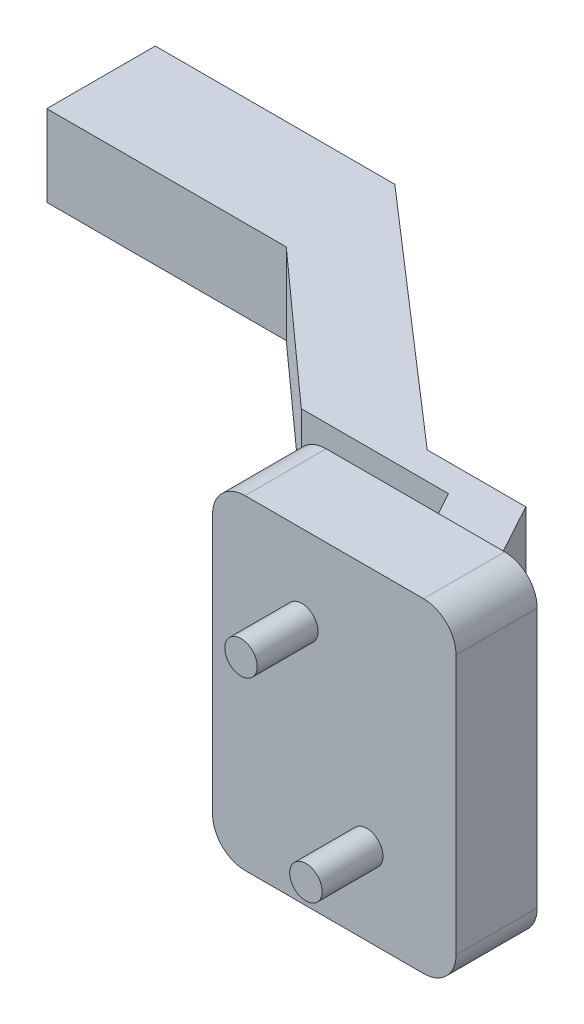
ISO-10303-21;
HEADER;
FILE_DESCRIPTION(('STEP AP214'),'2;1');
FILE_NAME('part.step','',(''),(''),'','','');
FILE_SCHEMA(('AUTOMOTIVE_DESIGN { 1 0 10303 214 1 1 1 1 }'));
ENDSEC;
DATA;
#1=APPLICATION_CONTEXT('core data for automotive mechanical design processes');
#2=APPLICATION_PROTOCOL_DEFINITION('international standard','automotive_design',2000,#1);
#3=PRODUCT_CONTEXT('',#1,'mechanical');
#4=PRODUCT('Part','Part','',(#3));
#5=PRODUCT_RELATED_PRODUCT_CATEGORY('part','',(#4));
#6=PRODUCT_DEFINITION_FORMATION('','',#4);
#7=PRODUCT_DEFINITION_CONTEXT('part definition',#1,'design');
#8=PRODUCT_DEFINITION('design','',#6,#7);
#9=PRODUCT_DEFINITION_SHAPE('','',#8);
#10=(LENGTH_UNIT() NAMED_UNIT(*) SI_UNIT(.MILLI.,.METRE.));
#11=(NAMED_UNIT(*) PLANE_ANGLE_UNIT() SI_UNIT($,.RADIAN.));
#12=(NAMED_UNIT(*) SI_UNIT($,.STERADIAN.) SOLID_ANGLE_UNIT());
#13=UNCERTAINTY_MEASURE_WITH_UNIT(LENGTH_MEASURE(1.E-05),#10,'distance_accuracy_value','');
#14=(GEOMETRIC_REPRESENTATION_CONTEXT(3) GLOBAL_UNCERTAINTY_ASSIGNED_CONTEXT((#13)) GLOBAL_UNIT_ASSIGNED_CONTEXT((#10,
#11,#12)) REPRESENTATION_CONTEXT('',''));
#15=CARTESIAN_POINT('',(0.,0.,0.));
#16=DIRECTION('',(0.,0.,1.));
#17=DIRECTION('',(1.,0.,0.));
#18=AXIS2_PLACEMENT_3D('',#15,#16,#17);
#19=CARTESIAN_POINT('',(-2.,5.,3.75));
#20=DIRECTION('',(0.,0.,-1.));
#21=DIRECTION('',(-1.,0.,0.));
#22=AXIS2_PLACEMENT_3D('',#19,#20,#21);
#23=CYLINDRICAL_SURFACE('',#22,1.);
#24=CARTESIAN_POINT('',(-2.,5.,3.75));
#25=DIRECTION('',(0.,0.,1.));
#26=DIRECTION('',(1.,0.,0.));
#27=AXIS2_PLACEMENT_3D('',#24,#25,#26);
#28=CIRCLE('',#27,1.);
#29=CARTESIAN_POINT('',(-1.,5.,3.75));
#30=VERTEX_POINT('',#29);
#31=EDGE_CURVE('E61',#30,#30,#28,.T.);
#32=ORIENTED_EDGE('',*,*,#31,.F.);
#33=EDGE_LOOP('',(#32));
#34=FACE_BOUND('',#33,.T.);
#35=CARTESIAN_POINT('',(-2.,5.,0.));
#36=DIRECTION('',(0.,0.,1.));
#37=DIRECTION('',(1.,0.,0.));
#38=AXIS2_PLACEMENT_3D('',#35,#36,#37);
#39=CIRCLE('',#38,1.);
#40=CARTESIAN_POINT('',(-1.,5.,0.));
#41=VERTEX_POINT('',#40);
#42=EDGE_CURVE('E358',#41,#41,#39,.T.);
#43=ORIENTED_EDGE('',*,*,#42,.T.);
#44=EDGE_LOOP('',(#43));
#45=FACE_BOUND('',#44,.T.);
#46=ADVANCED_FACE('F53',(#34,#45),#23,.T.);
#47=CARTESIAN_POINT('',(-2.,5.,3.75));
#48=DIRECTION('',(0.,0.,1.));
#49=DIRECTION('',(1.,0.,0.));
#50=AXIS2_PLACEMENT_3D('',#47,#48,#49);
#51=PLANE('',#50);
#52=ORIENTED_EDGE('',*,*,#31,.T.);
#53=EDGE_LOOP('',(#52));
#54=FACE_BOUND('',#53,.T.);
#55=ADVANCED_FACE('F435',(#54),#51,.T.);
#56=CARTESIAN_POINT('',(-5.5,-8.,-5.));
#57=DIRECTION('',(0.,0.,1.));
#58=DIRECTION('',(1.,0.,0.));
#59=AXIS2_PLACEMENT_3D('',#56,#57,#58);
#60=CYLINDRICAL_SURFACE('',#59,2.);
#61=CARTESIAN_POINT('',(-5.5,-8.,0.));
#62=DIRECTION('',(0.,0.,1.));
#63=DIRECTION('',(1.,0.,0.));
#64=AXIS2_PLACEMENT_3D('',#61,#62,#63);
#65=CIRCLE('',#64,2.);
#66=CARTESIAN_POINT('',(-7.5,-7.99999999999998,0.));
#67=VERTEX_POINT('',#66);
#68=CARTESIAN_POINT('',(-5.49999999999998,-10.,0.));
#69=VERTEX_POINT('',#68);
#70=EDGE_CURVE('E287',#67,#69,#65,.T.);
#71=ORIENTED_EDGE('',*,*,#70,.F.);
#72=DIRECTION('',(0.,0.,1.));
#73=VECTOR('',#72,1.);
#74=CARTESIAN_POINT('',(-7.5,-7.99999999999998,-5.));
#75=LINE('',#74,#73);
#76=CARTESIAN_POINT('',(-7.5,-7.99999999999998,-5.));
#77=VERTEX_POINT('',#76);
#78=EDGE_CURVE('E355',#77,#67,#75,.T.);
#79=ORIENTED_EDGE('',*,*,#78,.F.);
#80=CARTESIAN_POINT('',(-5.5,-8.,-5.));
#81=DIRECTION('',(0.,0.,1.));
#82=DIRECTION('',(1.,0.,0.));
#83=AXIS2_PLACEMENT_3D('',#80,#81,#82);
#84=CIRCLE('',#83,2.);
#85=CARTESIAN_POINT('',(-5.49999999999998,-10.,-5.));
#86=VERTEX_POINT('',#85);
#87=EDGE_CURVE('E291',#77,#86,#84,.T.);
#88=ORIENTED_EDGE('',*,*,#87,.T.);
#89=DIRECTION('',(0.,0.,1.));
#90=VECTOR('',#89,1.);
#91=CARTESIAN_POINT('',(-5.49999999999998,-10.,-5.));
#92=LINE('',#91,#90);
#93=EDGE_CURVE('E324',#86,#69,#92,.T.);
#94=ORIENTED_EDGE('',*,*,#93,.T.);
#95=EDGE_LOOP('',(#71,#79,#88,#94));
#96=FACE_BOUND('',#95,.T.);
#97=ADVANCED_FACE('F397',(#96),#60,.T.);
#98=CARTESIAN_POINT('',(-7.5,-7.99999999999998,-5.));
#99=DIRECTION('',(-1.,0.,0.));
#100=DIRECTION('',(0.,0.,1.));
#101=AXIS2_PLACEMENT_3D('',#98,#99,#100);
#102=PLANE('',#101);
#103=DIRECTION('',(0.,-1.,0.));
#104=VECTOR('',#103,1.);
#105=CARTESIAN_POINT('',(-7.5,-7.99999999999998,0.));
#106=LINE('',#105,#104);
#107=CARTESIAN_POINT('',(-7.5,7.99999999999999,0.));
#108=VERTEX_POINT('',#107);
#109=EDGE_CURVE('E296',#108,#67,#106,.T.);
#110=ORIENTED_EDGE('',*,*,#109,.F.);
#111=DIRECTION('',(0.,0.,1.));
#112=VECTOR('',#111,1.);
#113=CARTESIAN_POINT('',(-7.5,7.99999999999999,-5.));
#114=LINE('',#113,#112);
#115=CARTESIAN_POINT('',(-7.5,7.99999999999999,-5.));
#116=VERTEX_POINT('',#115);
#117=EDGE_CURVE('E359',#116,#108,#114,.T.);
#118=ORIENTED_EDGE('',*,*,#117,.F.);
#119=DIRECTION('',(0.,-1.,0.));
#120=VECTOR('',#119,1.);
#121=CARTESIAN_POINT('',(-7.5,-7.99999999999998,-5.));
#122=LINE('',#121,#120);
#123=EDGE_CURVE('E320',#116,#77,#122,.T.);
#124=ORIENTED_EDGE('',*,*,#123,.T.);
#125=ORIENTED_EDGE('',*,*,#78,.T.);
#126=EDGE_LOOP('',(#110,#118,#124,#125));
#127=FACE_BOUND('',#126,.T.);
#128=ADVANCED_FACE('F421',(#127),#102,.T.);
#129=CARTESIAN_POINT('',(-5.5,8.,-5.));
#130=DIRECTION('',(0.,0.,1.));
#131=DIRECTION('',(1.,0.,0.));
#132=AXIS2_PLACEMENT_3D('',#129,#130,#131);
#133=CYLINDRICAL_SURFACE('',#132,2.);
#134=CARTESIAN_POINT('',(-5.5,8.,0.));
#135=DIRECTION('',(0.,0.,1.));
#136=DIRECTION('',(-1.,0.,0.));
#137=AXIS2_PLACEMENT_3D('',#134,#135,#136);
#138=CIRCLE('',#137,2.);
#139=CARTESIAN_POINT('',(-5.49999999999998,10.,0.));
#140=VERTEX_POINT('',#139);
#141=EDGE_CURVE('E348',#140,#108,#138,.T.);
#142=ORIENTED_EDGE('',*,*,#141,.F.);
#143=DIRECTION('',(0.,0.,1.));
#144=VECTOR('',#143,1.);
#145=CARTESIAN_POINT('',(-5.49999999999998,10.,-5.));
#146=LINE('',#145,#144);
#147=CARTESIAN_POINT('',(-5.49999999999998,10.,-5.));
#148=VERTEX_POINT('',#147);
#149=EDGE_CURVE('E362',#148,#140,#146,.T.);
#150=ORIENTED_EDGE('',*,*,#149,.F.);
#151=CARTESIAN_POINT('',(-5.5,8.,-5.));
#152=DIRECTION('',(0.,0.,1.));
#153=DIRECTION('',(-1.,0.,0.));
#154=AXIS2_PLACEMENT_3D('',#151,#152,#153);
#155=CIRCLE('',#154,2.);
#156=EDGE_CURVE('E316',#148,#116,#155,.T.);
#157=ORIENTED_EDGE('',*,*,#156,.T.);
#158=ORIENTED_EDGE('',*,*,#117,.T.);
#159=EDGE_LOOP('',(#142,#150,#157,#158));
#160=FACE_BOUND('',#159,.T.);
#161=ADVANCED_FACE('F425',(#160),#133,.T.);
#162=CARTESIAN_POINT('',(-5.49999999999998,10.,-5.));
#163=DIRECTION('',(0.,1.,0.));
#164=DIRECTION('',(0.,0.,1.));
#165=AXIS2_PLACEMENT_3D('',#162,#163,#164);
#166=PLANE('',#165);
#167=DIRECTION('',(-1.,0.,0.));
#168=VECTOR('',#167,1.);
#169=CARTESIAN_POINT('',(-5.49999999999998,10.,0.));
#170=LINE('',#169,#168);
#171=CARTESIAN_POINT('',(5.49999999999999,10.,0.));
#172=VERTEX_POINT('',#171);
#173=EDGE_CURVE('E344',#172,#140,#170,.T.);
#174=ORIENTED_EDGE('',*,*,#173,.F.);
#175=DIRECTION('',(0.,0.,1.));
#176=VECTOR('',#175,1.);
#177=CARTESIAN_POINT('',(5.49999999999999,10.,-5.));
#178=LINE('',#177,#176);
#179=CARTESIAN_POINT('',(5.49999999999999,10.,-5.));
#180=VERTEX_POINT('',#179);
#181=EDGE_CURVE('E365',#180,#172,#178,.T.);
#182=ORIENTED_EDGE('',*,*,#181,.F.);
#183=DIRECTION('',(-1.,0.,0.));
#184=VECTOR('',#183,1.);
#185=CARTESIAN_POINT('',(-5.49999999999998,10.,-5.));
#186=LINE('',#185,#184);
#187=EDGE_CURVE('E312',#180,#148,#186,.T.);
#188=ORIENTED_EDGE('',*,*,#187,.T.);
#189=ORIENTED_EDGE('',*,*,#149,.T.);
#190=EDGE_LOOP('',(#174,#182,#188,#189));
#191=FACE_BOUND('',#190,.T.);
#192=ADVANCED_FACE('F417',(#191),#166,.T.);
#193=CARTESIAN_POINT('',(5.5,8.,-5.));
#194=DIRECTION('',(0.,0.,1.));
#195=DIRECTION('',(1.,0.,0.));
#196=AXIS2_PLACEMENT_3D('',#193,#194,#195);
#197=CYLINDRICAL_SURFACE('',#196,2.);
#198=CARTESIAN_POINT('',(5.5,8.,0.));
#199=DIRECTION('',(0.,0.,1.));
#200=DIRECTION('',(1.,0.,0.));
#201=AXIS2_PLACEMENT_3D('',#198,#199,#200);
#202=CIRCLE('',#201,2.);
#203=CARTESIAN_POINT('',(7.5,7.99999999999999,0.));
#204=VERTEX_POINT('',#203);
#205=EDGE_CURVE('E340',#204,#172,#202,.T.);
#206=ORIENTED_EDGE('',*,*,#205,.F.);
#207=DIRECTION('',(0.,0.,1.));
#208=VECTOR('',#207,1.);
#209=CARTESIAN_POINT('',(7.5,7.99999999999999,-5.));
#210=LINE('',#209,#208);
#211=CARTESIAN_POINT('',(7.5,7.99999999999999,-5.));
#212=VERTEX_POINT('',#211);
#213=EDGE_CURVE('E368',#212,#204,#210,.T.);
#214=ORIENTED_EDGE('',*,*,#213,.F.);
#215=CARTESIAN_POINT('',(5.5,8.,-5.));
#216=DIRECTION('',(0.,0.,1.));
#217=DIRECTION('',(1.,0.,0.));
#218=AXIS2_PLACEMENT_3D('',#215,#216,#217);
#219=CIRCLE('',#218,2.);
#220=EDGE_CURVE('E308',#212,#180,#219,.T.);
#221=ORIENTED_EDGE('',*,*,#220,.T.);
#222=ORIENTED_EDGE('',*,*,#181,.T.);
#223=EDGE_LOOP('',(#206,#214,#221,#222));
#224=FACE_BOUND('',#223,.T.);
#225=ADVANCED_FACE('F413',(#224),#197,.T.);
#226=CARTESIAN_POINT('',(7.5,-7.99999999999998,-5.));
#227=DIRECTION('',(1.,0.,0.));
#228=DIRECTION('',(0.,0.,-1.));
#229=AXIS2_PLACEMENT_3D('',#226,#227,#228);
#230=PLANE('',#229);
#231=DIRECTION('',(0.,1.,0.));
#232=VECTOR('',#231,1.);
#233=CARTESIAN_POINT('',(7.5,-7.99999999999998,0.));
#234=LINE('',#233,#232);
#235=CARTESIAN_POINT('',(7.5,-7.99999999999998,0.));
#236=VERTEX_POINT('',#235);
#237=EDGE_CURVE('E336',#236,#204,#234,.T.);
#238=ORIENTED_EDGE('',*,*,#237,.F.);
#239=DIRECTION('',(0.,0.,1.));
#240=VECTOR('',#239,1.);
#241=CARTESIAN_POINT('',(7.5,-7.99999999999998,-5.));
#242=LINE('',#241,#240);
#243=CARTESIAN_POINT('',(7.5,-7.99999999999998,-5.));
#244=VERTEX_POINT('',#243);
#245=EDGE_CURVE('E371',#244,#236,#242,.T.);
#246=ORIENTED_EDGE('',*,*,#245,.F.);
#247=DIRECTION('',(0.,1.,0.));
#248=VECTOR('',#247,1.);
#249=CARTESIAN_POINT('',(7.5,-7.99999999999998,-5.));
#250=LINE('',#249,#248);
#251=EDGE_CURVE('E304',#244,#212,#250,.T.);
#252=ORIENTED_EDGE('',*,*,#251,.T.);
#253=ORIENTED_EDGE('',*,*,#213,.T.);
#254=EDGE_LOOP('',(#238,#246,#252,#253));
#255=FACE_BOUND('',#254,.T.);
#256=ADVANCED_FACE('F409',(#255),#230,.T.);
#257=CARTESIAN_POINT('',(5.5,-8.,-5.));
#258=DIRECTION('',(0.,0.,1.));
#259=DIRECTION('',(1.,0.,0.));
#260=AXIS2_PLACEMENT_3D('',#257,#258,#259);
#261=CYLINDRICAL_SURFACE('',#260,2.);
#262=CARTESIAN_POINT('',(5.5,-8.,0.));
#263=DIRECTION('',(0.,0.,1.));
#264=DIRECTION('',(1.,0.,0.));
#265=AXIS2_PLACEMENT_3D('',#262,#263,#264);
#266=CIRCLE('',#265,2.);
#267=CARTESIAN_POINT('',(5.49999999999998,-10.,0.));
#268=VERTEX_POINT('',#267);
#269=EDGE_CURVE('E332',#268,#236,#266,.T.);
#270=ORIENTED_EDGE('',*,*,#269,.F.);
#271=DIRECTION('',(0.,0.,1.));
#272=VECTOR('',#271,1.);
#273=CARTESIAN_POINT('',(5.49999999999998,-10.,-5.));
#274=LINE('',#273,#272);
#275=CARTESIAN_POINT('',(5.49999999999998,-10.,-5.));
#276=VERTEX_POINT('',#275);
#277=EDGE_CURVE('E374',#276,#268,#274,.T.);
#278=ORIENTED_EDGE('',*,*,#277,.F.);
#279=CARTESIAN_POINT('',(5.5,-8.,-5.));
#280=DIRECTION('',(0.,0.,1.));
#281=DIRECTION('',(1.,0.,0.));
#282=AXIS2_PLACEMENT_3D('',#279,#280,#281);
#283=CIRCLE('',#282,2.);
#284=EDGE_CURVE('E300',#276,#244,#283,.T.);
#285=ORIENTED_EDGE('',*,*,#284,.T.);
#286=ORIENTED_EDGE('',*,*,#245,.T.);
#287=EDGE_LOOP('',(#270,#278,#285,#286));
#288=FACE_BOUND('',#287,.T.);
#289=ADVANCED_FACE('F405',(#288),#261,.T.);
#290=CARTESIAN_POINT('',(-5.49999999999998,-10.,-5.));
#291=DIRECTION('',(0.,-1.,0.));
#292=DIRECTION('',(0.,0.,-1.));
#293=AXIS2_PLACEMENT_3D('',#290,#291,#292);
#294=PLANE('',#293);
#295=DIRECTION('',(1.,0.,0.));
#296=VECTOR('',#295,1.);
#297=CARTESIAN_POINT('',(-5.49999999999998,-10.,0.));
#298=LINE('',#297,#296);
#299=EDGE_CURVE('E328',#69,#268,#298,.T.);
#300=ORIENTED_EDGE('',*,*,#299,.F.);
#301=ORIENTED_EDGE('',*,*,#93,.F.);
#302=DIRECTION('',(1.,0.,0.));
#303=VECTOR('',#302,1.);
#304=CARTESIAN_POINT('',(-5.49999999999998,-10.,-5.));
#305=LINE('',#304,#303);
#306=EDGE_CURVE('E295',#86,#276,#305,.T.);
#307=ORIENTED_EDGE('',*,*,#306,.T.);
#308=ORIENTED_EDGE('',*,*,#277,.T.);
#309=EDGE_LOOP('',(#300,#301,#307,#308));
#310=FACE_BOUND('',#309,.T.);
#311=ADVANCED_FACE('F401',(#310),#294,.T.);
#312=CARTESIAN_POINT('',(-5.5,-8.,-5.));
#313=DIRECTION('',(0.,0.,1.));
#314=DIRECTION('',(1.,0.,0.));
#315=AXIS2_PLACEMENT_3D('',#312,#313,#314);
#316=PLANE('',#315);
#317=DIRECTION('',(1.,0.,0.));
#318=VECTOR('',#317,1.);
#319=CARTESIAN_POINT('',(0.,-2.5,-5.));
#320=LINE('',#319,#318);
#321=CARTESIAN_POINT('',(-2.,-2.5,-5.));
#322=VERTEX_POINT('',#321);
#323=CARTESIAN_POINT('',(2.,-2.5,-5.));
#324=VERTEX_POINT('',#323);
#325=EDGE_CURVE('E255',#322,#324,#320,.T.);
#326=ORIENTED_EDGE('',*,*,#325,.T.);
#327=DIRECTION('',(0.,1.,0.));
#328=VECTOR('',#327,1.);
#329=CARTESIAN_POINT('',(2.,-2.5,-5.));
#330=LINE('',#329,#328);
#331=CARTESIAN_POINT('',(2.,2.5,-5.));
#332=VERTEX_POINT('',#331);
#333=EDGE_CURVE('E270',#324,#332,#330,.T.);
#334=ORIENTED_EDGE('',*,*,#333,.T.);
#335=DIRECTION('',(1.,0.,0.));
#336=VECTOR('',#335,1.);
#337=CARTESIAN_POINT('',(0.,2.5,-5.));
#338=LINE('',#337,#336);
#339=CARTESIAN_POINT('',(-2.,2.5,-5.));
#340=VERTEX_POINT('',#339);
#341=EDGE_CURVE('E239',#340,#332,#338,.T.);
#342=ORIENTED_EDGE('',*,*,#341,.F.);
#343=DIRECTION('',(0.,1.,0.));
#344=VECTOR('',#343,1.);
#345=CARTESIAN_POINT('',(-2.,-2.5,-5.));
#346=LINE('',#345,#344);
#347=EDGE_CURVE('E274',#322,#340,#346,.T.);
#348=ORIENTED_EDGE('',*,*,#347,.F.);
#349=EDGE_LOOP('',(#326,#334,#342,#348));
#350=FACE_BOUND('',#349,.T.);
#351=ORIENTED_EDGE('',*,*,#87,.F.);
#352=ORIENTED_EDGE('',*,*,#123,.F.);
#353=ORIENTED_EDGE('',*,*,#156,.F.);
#354=ORIENTED_EDGE('',*,*,#187,.F.);
#355=ORIENTED_EDGE('',*,*,#220,.F.);
#356=ORIENTED_EDGE('',*,*,#251,.F.);
#357=ORIENTED_EDGE('',*,*,#284,.F.);
#358=ORIENTED_EDGE('',*,*,#306,.F.);
#359=EDGE_LOOP('',(#351,#352,#353,#354,#355,#356,#357,#358));
#360=FACE_BOUND('',#359,.T.);
#361=ADVANCED_FACE('F390',(#350,#360),#316,.F.);
#362=CARTESIAN_POINT('',(-5.5,-8.,0.));
#363=DIRECTION('',(0.,0.,1.));
#364=DIRECTION('',(1.,0.,0.));
#365=AXIS2_PLACEMENT_3D('',#362,#363,#364);
#366=PLANE('',#365);
#367=CARTESIAN_POINT('',(2.,-5.,0.));
#368=DIRECTION('',(0.,0.,1.));
#369=DIRECTION('',(1.,0.,0.));
#370=AXIS2_PLACEMENT_3D('',#367,#368,#369);
#371=CIRCLE('',#370,1.);
#372=CARTESIAN_POINT('',(3.,-5.,0.));
#373=VERTEX_POINT('',#372);
#374=EDGE_CURVE('E283',#373,#373,#371,.T.);
#375=ORIENTED_EDGE('',*,*,#374,.F.);
#376=EDGE_LOOP('',(#375));
#377=FACE_BOUND('',#376,.T.);
#378=ORIENTED_EDGE('',*,*,#42,.F.);
#379=EDGE_LOOP('',(#378));
#380=FACE_BOUND('',#379,.T.);
#381=ORIENTED_EDGE('',*,*,#70,.T.);
#382=ORIENTED_EDGE('',*,*,#299,.T.);
#383=ORIENTED_EDGE('',*,*,#269,.T.);
#384=ORIENTED_EDGE('',*,*,#237,.T.);
#385=ORIENTED_EDGE('',*,*,#205,.T.);
#386=ORIENTED_EDGE('',*,*,#173,.T.);
#387=ORIENTED_EDGE('',*,*,#141,.T.);
#388=ORIENTED_EDGE('',*,*,#109,.T.);
#389=EDGE_LOOP('',(#381,#382,#383,#384,#385,#386,#387,#388));
#390=FACE_BOUND('',#389,.T.);
#391=ADVANCED_FACE('F386',(#377,#380,#390),#366,.T.);
#392=CARTESIAN_POINT('',(2.,-5.,3.75));
#393=DIRECTION('',(0.,0.,-1.));
#394=DIRECTION('',(-1.,0.,0.));
#395=AXIS2_PLACEMENT_3D('',#392,#393,#394);
#396=CYLINDRICAL_SURFACE('',#395,1.);
#397=CARTESIAN_POINT('',(2.,-5.,3.75));
#398=DIRECTION('',(0.,0.,1.));
#399=DIRECTION('',(1.,0.,0.));
#400=AXIS2_PLACEMENT_3D('',#397,#398,#399);
#401=CIRCLE('',#400,1.);
#402=CARTESIAN_POINT('',(3.,-5.,3.75));
#403=VERTEX_POINT('',#402);
#404=EDGE_CURVE('E269',#403,#403,#401,.T.);
#405=ORIENTED_EDGE('',*,*,#404,.F.);
#406=EDGE_LOOP('',(#405));
#407=FACE_BOUND('',#406,.T.);
#408=ORIENTED_EDGE('',*,*,#374,.T.);
#409=EDGE_LOOP('',(#408));
#410=FACE_BOUND('',#409,.T.);
#411=ADVANCED_FACE('F389',(#407,#410),#396,.T.);
#412=CARTESIAN_POINT('',(2.,-5.,3.75));
#413=DIRECTION('',(0.,0.,1.));
#414=DIRECTION('',(1.,0.,0.));
#415=AXIS2_PLACEMENT_3D('',#412,#413,#414);
#416=PLANE('',#415);
#417=ORIENTED_EDGE('',*,*,#404,.T.);
#418=EDGE_LOOP('',(#417));
#419=FACE_BOUND('',#418,.T.);
#420=ADVANCED_FACE('F487',(#419),#416,.T.);
#421=CARTESIAN_POINT('',(0.,-2.5,-15.5540432849943));
#422=DIRECTION('',(0.,0.,-1.));
#423=DIRECTION('',(-1.,0.,0.));
#424=AXIS2_PLACEMENT_3D('',#421,#422,#423);
#425=PLANE('',#424);
#426=DIRECTION('',(0.,-1.,0.));
#427=VECTOR('',#426,1.);
#428=CARTESIAN_POINT('',(-9.83176799494838,2.5,-15.5540432849943));
#429=LINE('',#428,#427);
#430=CARTESIAN_POINT('',(-9.83176799494837,2.5,-15.5540432849943));
#431=VERTEX_POINT('',#430);
#432=CARTESIAN_POINT('',(-9.83176799494837,-2.5,-15.5540432849943));
#433=VERTEX_POINT('',#432);
#434=EDGE_CURVE('E224',#431,#433,#429,.T.);
#435=ORIENTED_EDGE('',*,*,#434,.F.);
#436=DIRECTION('',(-1.,0.,0.));
#437=VECTOR('',#436,1.);
#438=CARTESIAN_POINT('',(0.,2.5,-15.5540432849943));
#439=LINE('',#438,#437);
#440=CARTESIAN_POINT('',(-3.75530091546015,2.5,-15.5540432849943));
#441=VERTEX_POINT('',#440);
#442=EDGE_CURVE('E246',#441,#431,#439,.T.);
#443=ORIENTED_EDGE('',*,*,#442,.F.);
#444=DIRECTION('',(0.,1.,0.));
#445=VECTOR('',#444,1.);
#446=CARTESIAN_POINT('',(-3.75530091546015,-2.5,-15.5540432849943));
#447=LINE('',#446,#445);
#448=CARTESIAN_POINT('',(-3.75530091546015,-2.5,-15.5540432849943));
#449=VERTEX_POINT('',#448);
#450=EDGE_CURVE('E266',#449,#441,#447,.T.);
#451=ORIENTED_EDGE('',*,*,#450,.F.);
#452=DIRECTION('',(-1.,0.,0.));
#453=VECTOR('',#452,1.);
#454=CARTESIAN_POINT('',(0.,-2.5,-15.5540432849943));
#455=LINE('',#454,#453);
#456=EDGE_CURVE('E75',#449,#433,#455,.T.);
#457=ORIENTED_EDGE('',*,*,#456,.T.);
#458=EDGE_LOOP('',(#435,#443,#451,#457));
#459=FACE_BOUND('',#458,.T.);
#460=ADVANCED_FACE('F496',(#459),#425,.T.);
#461=CARTESIAN_POINT('',(3.6432034560071,-2.5,-1.98670136357855));
#462=DIRECTION('',(0.877946273081663,0.,-0.478759168666271));
#463=DIRECTION('',(-0.478759168666271,0.,-0.877946273081662));
#464=AXIS2_PLACEMENT_3D('',#461,#462,#463);
#465=PLANE('',#464);
#466=ORIENTED_EDGE('',*,*,#450,.T.);
#467=DIRECTION('',(-0.478759168666271,0.,-0.877946273081663));
#468=VECTOR('',#467,1.);
#469=CARTESIAN_POINT('',(3.6432034560071,2.5,-1.98670136357855));
#470=LINE('',#469,#468);
#471=EDGE_CURVE('E242',#332,#441,#470,.T.);
#472=ORIENTED_EDGE('',*,*,#471,.F.);
#473=ORIENTED_EDGE('',*,*,#333,.F.);
#474=DIRECTION('',(-0.478759168666271,0.,-0.877946273081663));
#475=VECTOR('',#474,1.);
#476=CARTESIAN_POINT('',(3.6432034560071,-2.5,-1.98670136357855));
#477=LINE('',#476,#475);
#478=EDGE_CURVE('E259',#324,#449,#477,.T.);
#479=ORIENTED_EDGE('',*,*,#478,.T.);
#480=EDGE_LOOP('',(#466,#472,#473,#479));
#481=FACE_BOUND('',#480,.T.);
#482=ADVANCED_FACE('F509',(#481),#465,.T.);
#483=CARTESIAN_POINT('',(0.560044822335176,-2.5,-0.305402052241639));
#484=DIRECTION('',(0.877946273081663,0.,-0.478759168666271));
#485=DIRECTION('',(-0.478759168666271,0.,-0.877946273081663));
#486=AXIS2_PLACEMENT_3D('',#483,#484,#485);
#487=PLANE('',#486);
#488=ORIENTED_EDGE('',*,*,#347,.T.);
#489=DIRECTION('',(-0.478759168666271,0.,-0.877946273081663));
#490=VECTOR('',#489,1.);
#491=CARTESIAN_POINT('',(0.560044822335176,2.5,-0.305402052241639));
#492=LINE('',#491,#490);
#493=CARTESIAN_POINT('',(-6.83845954913207,2.5,-13.8727439736574));
#494=VERTEX_POINT('',#493);
#495=EDGE_CURVE('E235',#340,#494,#492,.T.);
#496=ORIENTED_EDGE('',*,*,#495,.T.);
#497=DIRECTION('',(0.,1.,0.));
#498=VECTOR('',#497,1.);
#499=CARTESIAN_POINT('',(-6.83845954913207,-2.5,-13.8727439736574));
#500=LINE('',#499,#498);
#501=CARTESIAN_POINT('',(-6.83845954913207,-2.5,-13.8727439736574));
#502=VERTEX_POINT('',#501);
#503=EDGE_CURVE('E277',#502,#494,#500,.T.);
#504=ORIENTED_EDGE('',*,*,#503,.F.);
#505=DIRECTION('',(-0.478759168666271,0.,-0.877946273081663));
#506=VECTOR('',#505,1.);
#507=CARTESIAN_POINT('',(0.560044822335176,-2.5,-0.305402052241639));
#508=LINE('',#507,#506);
#509=EDGE_CURVE('E252',#322,#502,#508,.T.);
#510=ORIENTED_EDGE('',*,*,#509,.F.);
#511=EDGE_LOOP('',(#488,#496,#504,#510));
#512=FACE_BOUND('',#511,.T.);
#513=ADVANCED_FACE('F513',(#512),#487,.F.);
#514=CARTESIAN_POINT('',(0.,-2.5,-13.8727439736574));
#515=DIRECTION('',(0.,0.,-1.));
#516=DIRECTION('',(-1.,0.,0.));
#517=AXIS2_PLACEMENT_3D('',#514,#515,#516);
#518=PLANE('',#517);
#519=ORIENTED_EDGE('',*,*,#503,.T.);
#520=DIRECTION('',(-1.,0.,0.));
#521=VECTOR('',#520,1.);
#522=CARTESIAN_POINT('',(0.,2.5,-13.8727439736574));
#523=LINE('',#522,#521);
#524=CARTESIAN_POINT('',(-15.9082350744366,2.5,-13.8727439736574));
#525=VERTEX_POINT('',#524);
#526=EDGE_CURVE('E227',#494,#525,#523,.T.);
#527=ORIENTED_EDGE('',*,*,#526,.T.);
#528=DIRECTION('',(0.,1.,0.));
#529=VECTOR('',#528,1.);
#530=CARTESIAN_POINT('',(-15.9082350744366,-2.5,-13.8727439736574));
#531=LINE('',#530,#529);
#532=CARTESIAN_POINT('',(-15.9082350744366,-2.5,-13.8727439736574));
#533=VERTEX_POINT('',#532);
#534=EDGE_CURVE('E265',#533,#525,#531,.T.);
#535=ORIENTED_EDGE('',*,*,#534,.F.);
#536=DIRECTION('',(-1.,0.,0.));
#537=VECTOR('',#536,1.);
#538=CARTESIAN_POINT('',(0.,-2.5,-13.8727439736574));
#539=LINE('',#538,#537);
#540=EDGE_CURVE('E249',#502,#533,#539,.T.);
#541=ORIENTED_EDGE('',*,*,#540,.F.);
#542=EDGE_LOOP('',(#519,#527,#535,#541));
#543=FACE_BOUND('',#542,.T.);
#544=ADVANCED_FACE('F522',(#543),#518,.F.);
#545=CARTESIAN_POINT('',(0.,-2.5,0.));
#546=DIRECTION('',(0.,1.,0.));
#547=DIRECTION('',(0.,0.,1.));
#548=AXIS2_PLACEMENT_3D('',#545,#546,#547);
#549=PLANE('',#548);
#550=DIRECTION('',(-1.,0.,0.));
#551=VECTOR('',#550,1.);
#552=CARTESIAN_POINT('',(-24.9984817526115,-2.5,-22.0394077889031));
#553=LINE('',#552,#551);
#554=CARTESIAN_POINT('',(-24.9984817526115,-2.5,-22.0394077889031));
#555=VERTEX_POINT('',#554);
#556=CARTESIAN_POINT('',(-39.7529004968759,-2.5,-22.0394077889031));
#557=VERTEX_POINT('',#556);
#558=EDGE_CURVE('E214',#555,#557,#553,.T.);
#559=ORIENTED_EDGE('',*,*,#558,.T.);
#560=DIRECTION('',(0.,0.,-1.));
#561=VECTOR('',#560,1.);
#562=CARTESIAN_POINT('',(-39.7529004968759,-2.5,0.));
#563=LINE('',#562,#561);
#564=CARTESIAN_POINT('',(-39.7529004968759,-2.5,-28.7250729038948));
#565=VERTEX_POINT('',#564);
#566=EDGE_CURVE('E67',#557,#565,#563,.T.);
#567=ORIENTED_EDGE('',*,*,#566,.T.);
#568=DIRECTION('',(1.,0.,0.));
#569=VECTOR('',#568,1.);
#570=CARTESIAN_POINT('',(-24.9984817526115,-2.5,-28.7250729038948));
#571=LINE('',#570,#569);
#572=CARTESIAN_POINT('',(-24.9984817526115,-2.5,-28.7250729038948));
#573=VERTEX_POINT('',#572);
#574=EDGE_CURVE('E191',#565,#573,#571,.T.);
#575=ORIENTED_EDGE('',*,*,#574,.T.);
#576=DIRECTION('',(0.755034693423013,0.,0.655684841770509));
#577=VECTOR('',#576,1.);
#578=CARTESIAN_POINT('',(-9.83176799494838,-2.5,-15.5540432849943));
#579=LINE('',#578,#577);
#580=EDGE_CURVE('E220',#573,#433,#579,.T.);
#581=ORIENTED_EDGE('',*,*,#580,.T.);
#582=ORIENTED_EDGE('',*,*,#456,.F.);
#583=ORIENTED_EDGE('',*,*,#478,.F.);
#584=ORIENTED_EDGE('',*,*,#325,.F.);
#585=ORIENTED_EDGE('',*,*,#509,.T.);
#586=ORIENTED_EDGE('',*,*,#540,.T.);
#587=DIRECTION('',(-0.743886237464227,0.,-0.668306266401353));
#588=VECTOR('',#587,1.);
#589=CARTESIAN_POINT('',(-15.9082350744366,-2.5,-13.8727439736574));
#590=LINE('',#589,#588);
#591=EDGE_CURVE('E210',#533,#555,#590,.T.);
#592=ORIENTED_EDGE('',*,*,#591,.T.);
#593=EDGE_LOOP('',(#559,#567,#575,#581,#582,#583,#584,#585,#586,#592));
#594=FACE_BOUND('',#593,.T.);
#595=ADVANCED_FACE('F537',(#594),#549,.F.);
#596=CARTESIAN_POINT('',(0.,2.5,0.));
#597=DIRECTION('',(0.,1.,0.));
#598=DIRECTION('',(0.,0.,1.));
#599=AXIS2_PLACEMENT_3D('',#596,#597,#598);
#600=PLANE('',#599);
#601=DIRECTION('',(0.,0.,-1.));
#602=VECTOR('',#601,1.);
#603=CARTESIAN_POINT('',(-39.7529004968759,2.5,-18.7250729038948));
#604=LINE('',#603,#602);
#605=CARTESIAN_POINT('',(-39.7529004968759,2.5,-22.0394077889031));
#606=VERTEX_POINT('',#605);
#607=CARTESIAN_POINT('',(-39.7529004968759,2.5,-28.7250729038948));
#608=VERTEX_POINT('',#607);
#609=EDGE_CURVE('E175',#606,#608,#604,.T.);
#610=ORIENTED_EDGE('',*,*,#609,.F.);
#611=DIRECTION('',(-1.,0.,0.));
#612=VECTOR('',#611,1.);
#613=CARTESIAN_POINT('',(-24.9984817526115,2.5,-22.0394077889031));
#614=LINE('',#613,#612);
#615=CARTESIAN_POINT('',(-24.9984817526115,2.5,-22.0394077889031));
#616=VERTEX_POINT('',#615);
#617=EDGE_CURVE('E200',#616,#606,#614,.T.);
#618=ORIENTED_EDGE('',*,*,#617,.F.);
#619=DIRECTION('',(-0.743886237464227,0.,-0.668306266401353));
#620=VECTOR('',#619,1.);
#621=CARTESIAN_POINT('',(-15.9082350744366,2.5,-13.8727439736574));
#622=LINE('',#621,#620);
#623=EDGE_CURVE('E206',#525,#616,#622,.T.);
#624=ORIENTED_EDGE('',*,*,#623,.F.);
#625=ORIENTED_EDGE('',*,*,#526,.F.);
#626=ORIENTED_EDGE('',*,*,#495,.F.);
#627=ORIENTED_EDGE('',*,*,#341,.T.);
#628=ORIENTED_EDGE('',*,*,#471,.T.);
#629=ORIENTED_EDGE('',*,*,#442,.T.);
#630=DIRECTION('',(0.755034693423013,0.,0.655684841770509));
#631=VECTOR('',#630,1.);
#632=CARTESIAN_POINT('',(-9.83176799494838,2.5,-15.5540432849943));
#633=LINE('',#632,#631);
#634=CARTESIAN_POINT('',(-24.9984817526115,2.5,-28.7250729038948));
#635=VERTEX_POINT('',#634);
#636=EDGE_CURVE('E198',#635,#431,#633,.T.);
#637=ORIENTED_EDGE('',*,*,#636,.F.);
#638=DIRECTION('',(1.,0.,0.));
#639=VECTOR('',#638,1.);
#640=CARTESIAN_POINT('',(-24.9984817526115,2.5,-28.7250729038948));
#641=LINE('',#640,#639);
#642=EDGE_CURVE('E189',#608,#635,#641,.T.);
#643=ORIENTED_EDGE('',*,*,#642,.F.);
#644=EDGE_LOOP('',(#610,#618,#624,#625,#626,#627,#628,#629,#637,#643));
#645=FACE_BOUND('',#644,.T.);
#646=ADVANCED_FACE('F195',(#645),#600,.T.);
#647=CARTESIAN_POINT('',(-9.83176799494838,2.5,-15.5540432849943));
#648=DIRECTION('',(0.655684841770509,0.,-0.755034693423013));
#649=DIRECTION('',(-0.755034693423013,0.,-0.655684841770509));
#650=AXIS2_PLACEMENT_3D('',#647,#648,#649);
#651=PLANE('',#650);
#652=ORIENTED_EDGE('',*,*,#580,.F.);
#653=DIRECTION('',(0.,-1.,0.));
#654=VECTOR('',#653,1.);
#655=CARTESIAN_POINT('',(-24.9984817526115,2.5,-28.7250729038948));
#656=LINE('',#655,#654);
#657=EDGE_CURVE('E228',#635,#573,#656,.T.);
#658=ORIENTED_EDGE('',*,*,#657,.F.);
#659=ORIENTED_EDGE('',*,*,#636,.T.);
#660=ORIENTED_EDGE('',*,*,#434,.T.);
#661=EDGE_LOOP('',(#652,#658,#659,#660));
#662=FACE_BOUND('',#661,.T.);
#663=ADVANCED_FACE('F544',(#662),#651,.T.);
#664=CARTESIAN_POINT('',(-24.9984817526115,2.5,-28.7250729038948));
#665=DIRECTION('',(0.,0.,-1.));
#666=DIRECTION('',(-1.,0.,0.));
#667=AXIS2_PLACEMENT_3D('',#664,#665,#666);
#668=PLANE('',#667);
#669=DIRECTION('',(0.,-1.,0.));
#670=VECTOR('',#669,1.);
#671=CARTESIAN_POINT('',(-39.7529004968759,-2.5,-28.7250729038948));
#672=LINE('',#671,#670);
#673=EDGE_CURVE('E178',#608,#565,#672,.T.);
#674=ORIENTED_EDGE('',*,*,#673,.F.);
#675=ORIENTED_EDGE('',*,*,#642,.T.);
#676=ORIENTED_EDGE('',*,*,#657,.T.);
#677=ORIENTED_EDGE('',*,*,#574,.F.);
#678=EDGE_LOOP('',(#674,#675,#676,#677));
#679=FACE_BOUND('',#678,.T.);
#680=ADVANCED_FACE('F187',(#679),#668,.T.);
#681=CARTESIAN_POINT('',(-24.9984817526115,2.5,-22.0394077889031));
#682=DIRECTION('',(0.,0.,1.));
#683=DIRECTION('',(1.,0.,0.));
#684=AXIS2_PLACEMENT_3D('',#681,#682,#683);
#685=PLANE('',#684);
#686=DIRECTION('',(0.,1.,0.));
#687=VECTOR('',#686,1.);
#688=CARTESIAN_POINT('',(-39.7529004968759,2.5,-22.0394077889031));
#689=LINE('',#688,#687);
#690=EDGE_CURVE('E11',#557,#606,#689,.T.);
#691=ORIENTED_EDGE('',*,*,#690,.F.);
#692=ORIENTED_EDGE('',*,*,#558,.F.);
#693=DIRECTION('',(0.,-1.,0.));
#694=VECTOR('',#693,1.);
#695=CARTESIAN_POINT('',(-24.9984817526115,2.5,-22.0394077889031));
#696=LINE('',#695,#694);
#697=EDGE_CURVE('E204',#616,#555,#696,.T.);
#698=ORIENTED_EDGE('',*,*,#697,.F.);
#699=ORIENTED_EDGE('',*,*,#617,.T.);
#700=EDGE_LOOP('',(#691,#692,#698,#699));
#701=FACE_BOUND('',#700,.T.);
#702=ADVANCED_FACE('F559',(#701),#685,.T.);
#703=CARTESIAN_POINT('',(-15.9082350744366,2.5,-13.8727439736574));
#704=DIRECTION('',(-0.668306266401353,0.,0.743886237464227));
#705=DIRECTION('',(0.743886237464227,0.,0.668306266401353));
#706=AXIS2_PLACEMENT_3D('',#703,#704,#705);
#707=PLANE('',#706);
#708=ORIENTED_EDGE('',*,*,#591,.F.);
#709=ORIENTED_EDGE('',*,*,#534,.T.);
#710=ORIENTED_EDGE('',*,*,#623,.T.);
#711=ORIENTED_EDGE('',*,*,#697,.T.);
#712=EDGE_LOOP('',(#708,#709,#710,#711));
#713=FACE_BOUND('',#712,.T.);
#714=ADVANCED_FACE('F555',(#713),#707,.T.);
#715=CARTESIAN_POINT('',(-39.7529004968759,-2.5,-18.7250729038948));
#716=DIRECTION('',(1.,0.,0.));
#717=DIRECTION('',(0.,0.,-1.));
#718=AXIS2_PLACEMENT_3D('',#715,#716,#717);
#719=PLANE('',#718);
#720=ORIENTED_EDGE('',*,*,#690,.T.);
#721=ORIENTED_EDGE('',*,*,#609,.T.);
#722=ORIENTED_EDGE('',*,*,#673,.T.);
#723=ORIENTED_EDGE('',*,*,#566,.F.);
#724=EDGE_LOOP('',(#720,#721,#722,#723));
#725=FACE_BOUND('',#724,.T.);
#726=ADVANCED_FACE('F177',(#725),#719,.F.);
#727=CLOSED_SHELL('',(#46,#55,#97,#128,#161,#192,#225,#256,#289,#311,#361,#391,#411,#420,#460,
#482,#513,#544,#595,#646,#663,#680,#702,#714,#726));
#728=MANIFOLD_SOLID_BREP('B2',#727);
#729=ADVANCED_BREP_SHAPE_REPRESENTATION('',(#18,#728),#14);
#730=SHAPE_DEFINITION_REPRESENTATION(#9,#729);
ENDSEC;
END-ISO-10303-21;
